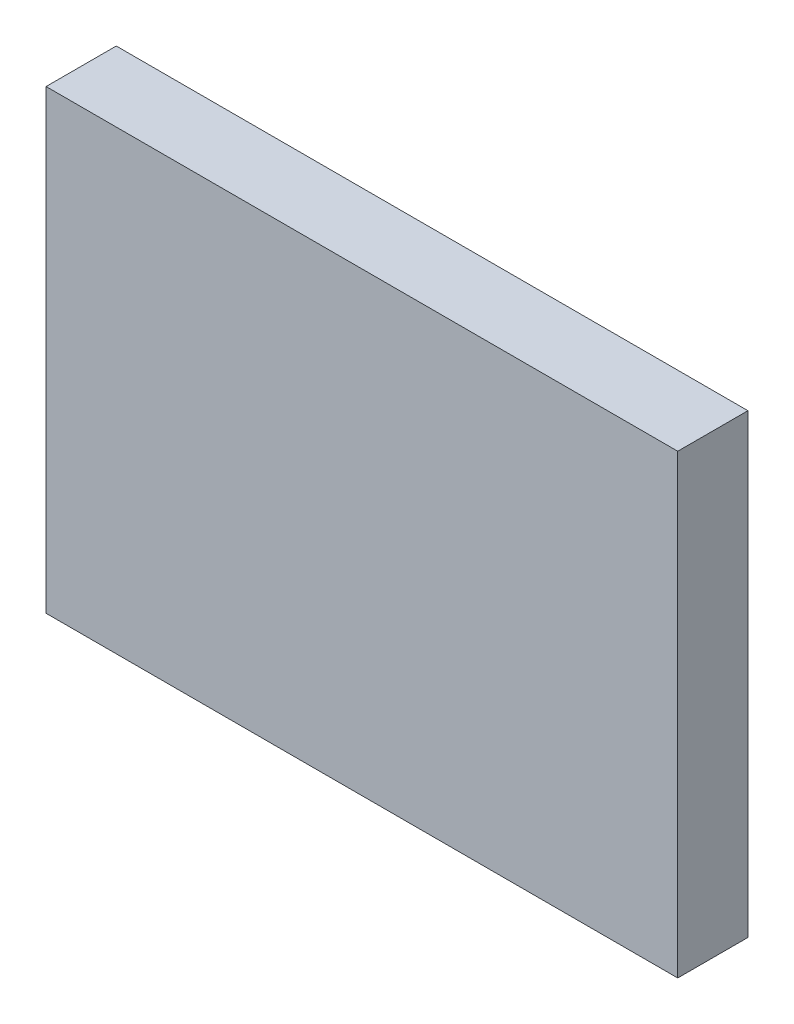
ISO-10303-21;
HEADER;
FILE_DESCRIPTION(('STEP AP214'),'2;1');
FILE_NAME('part.step','',(''),(''),'','','');
FILE_SCHEMA(('AUTOMOTIVE_DESIGN { 1 0 10303 214 1 1 1 1 }'));
ENDSEC;
DATA;
#1=APPLICATION_CONTEXT('core data for automotive mechanical design processes');
#2=APPLICATION_PROTOCOL_DEFINITION('international standard','automotive_design',2000,#1);
#3=PRODUCT_CONTEXT('',#1,'mechanical');
#4=PRODUCT('Part','Part','',(#3));
#5=PRODUCT_RELATED_PRODUCT_CATEGORY('part','',(#4));
#6=PRODUCT_DEFINITION_FORMATION('','',#4);
#7=PRODUCT_DEFINITION_CONTEXT('part definition',#1,'design');
#8=PRODUCT_DEFINITION('design','',#6,#7);
#9=PRODUCT_DEFINITION_SHAPE('','',#8);
#10=(LENGTH_UNIT() NAMED_UNIT(*) SI_UNIT(.MILLI.,.METRE.));
#11=(NAMED_UNIT(*) PLANE_ANGLE_UNIT() SI_UNIT($,.RADIAN.));
#12=(NAMED_UNIT(*) SI_UNIT($,.STERADIAN.) SOLID_ANGLE_UNIT());
#13=UNCERTAINTY_MEASURE_WITH_UNIT(LENGTH_MEASURE(1.E-05),#10,'distance_accuracy_value','');
#14=(GEOMETRIC_REPRESENTATION_CONTEXT(3) GLOBAL_UNCERTAINTY_ASSIGNED_CONTEXT((#13)) GLOBAL_UNIT_ASSIGNED_CONTEXT((#10,
#11,#12)) REPRESENTATION_CONTEXT('',''));
#15=CARTESIAN_POINT('',(0.,0.,0.));
#16=DIRECTION('',(0.,0.,1.));
#17=DIRECTION('',(1.,0.,0.));
#18=AXIS2_PLACEMENT_3D('',#15,#16,#17);
#19=CARTESIAN_POINT('',(-9.,-6.5,2.));
#20=DIRECTION('',(1.,0.,0.));
#21=DIRECTION('',(0.,0.,-1.));
#22=AXIS2_PLACEMENT_3D('',#19,#20,#21);
#23=PLANE('',#22);
#24=DIRECTION('',(0.,-1.,0.));
#25=VECTOR('',#24,1.);
#26=CARTESIAN_POINT('',(-9.,-6.5,0.));
#27=LINE('',#26,#25);
#28=CARTESIAN_POINT('',(-9.,6.5,0.));
#29=VERTEX_POINT('',#28);
#30=CARTESIAN_POINT('',(-9.,-6.5,0.));
#31=VERTEX_POINT('',#30);
#32=EDGE_CURVE('E102',#29,#31,#27,.T.);
#33=ORIENTED_EDGE('',*,*,#32,.T.);
#34=DIRECTION('',(0.,0.,-1.));
#35=VECTOR('',#34,1.);
#36=CARTESIAN_POINT('',(-9.,-6.5,2.));
#37=LINE('',#36,#35);
#38=CARTESIAN_POINT('',(-9.,-6.5,2.));
#39=VERTEX_POINT('',#38);
#40=EDGE_CURVE('E11',#39,#31,#37,.T.);
#41=ORIENTED_EDGE('',*,*,#40,.F.);
#42=DIRECTION('',(0.,-1.,0.));
#43=VECTOR('',#42,1.);
#44=CARTESIAN_POINT('',(-9.,-6.5,2.));
#45=LINE('',#44,#43);
#46=CARTESIAN_POINT('',(-9.,6.5,2.));
#47=VERTEX_POINT('',#46);
#48=EDGE_CURVE('E90',#47,#39,#45,.T.);
#49=ORIENTED_EDGE('',*,*,#48,.F.);
#50=DIRECTION('',(0.,0.,-1.));
#51=VECTOR('',#50,1.);
#52=CARTESIAN_POINT('',(-9.,6.5,2.));
#53=LINE('',#52,#51);
#54=EDGE_CURVE('E98',#47,#29,#53,.T.);
#55=ORIENTED_EDGE('',*,*,#54,.T.);
#56=EDGE_LOOP('',(#33,#41,#49,#55));
#57=FACE_BOUND('',#56,.T.);
#58=ADVANCED_FACE('F39',(#57),#23,.F.);
#59=CARTESIAN_POINT('',(-9.,-6.5,2.));
#60=DIRECTION('',(0.,1.,0.));
#61=DIRECTION('',(0.,0.,1.));
#62=AXIS2_PLACEMENT_3D('',#59,#60,#61);
#63=PLANE('',#62);
#64=DIRECTION('',(1.,0.,0.));
#65=VECTOR('',#64,1.);
#66=CARTESIAN_POINT('',(-9.,-6.5,0.));
#67=LINE('',#66,#65);
#68=CARTESIAN_POINT('',(9.,-6.5,0.));
#69=VERTEX_POINT('',#68);
#70=EDGE_CURVE('E94',#31,#69,#67,.T.);
#71=ORIENTED_EDGE('',*,*,#70,.T.);
#72=DIRECTION('',(0.,0.,-1.));
#73=VECTOR('',#72,1.);
#74=CARTESIAN_POINT('',(9.,-6.5,2.));
#75=LINE('',#74,#73);
#76=CARTESIAN_POINT('',(9.,-6.5,2.));
#77=VERTEX_POINT('',#76);
#78=EDGE_CURVE('E47',#77,#69,#75,.T.);
#79=ORIENTED_EDGE('',*,*,#78,.F.);
#80=DIRECTION('',(1.,0.,0.));
#81=VECTOR('',#80,1.);
#82=CARTESIAN_POINT('',(-9.,-6.5,2.));
#83=LINE('',#82,#81);
#84=EDGE_CURVE('E85',#39,#77,#83,.T.);
#85=ORIENTED_EDGE('',*,*,#84,.F.);
#86=ORIENTED_EDGE('',*,*,#40,.T.);
#87=EDGE_LOOP('',(#71,#79,#85,#86));
#88=FACE_BOUND('',#87,.T.);
#89=ADVANCED_FACE('F93',(#88),#63,.F.);
#90=CARTESIAN_POINT('',(9.,-6.5,2.));
#91=DIRECTION('',(-1.,0.,0.));
#92=DIRECTION('',(0.,0.,1.));
#93=AXIS2_PLACEMENT_3D('',#90,#91,#92);
#94=PLANE('',#93);
#95=DIRECTION('',(0.,1.,0.));
#96=VECTOR('',#95,1.);
#97=CARTESIAN_POINT('',(9.,-6.5,0.));
#98=LINE('',#97,#96);
#99=CARTESIAN_POINT('',(9.,6.5,0.));
#100=VERTEX_POINT('',#99);
#101=EDGE_CURVE('E72',#69,#100,#98,.T.);
#102=ORIENTED_EDGE('',*,*,#101,.T.);
#103=DIRECTION('',(0.,0.,-1.));
#104=VECTOR('',#103,1.);
#105=CARTESIAN_POINT('',(9.,6.5,2.));
#106=LINE('',#105,#104);
#107=CARTESIAN_POINT('',(9.,6.5,2.));
#108=VERTEX_POINT('',#107);
#109=EDGE_CURVE('E95',#108,#100,#106,.T.);
#110=ORIENTED_EDGE('',*,*,#109,.F.);
#111=DIRECTION('',(0.,1.,0.));
#112=VECTOR('',#111,1.);
#113=CARTESIAN_POINT('',(9.,-6.5,2.));
#114=LINE('',#113,#112);
#115=EDGE_CURVE('E88',#77,#108,#114,.T.);
#116=ORIENTED_EDGE('',*,*,#115,.F.);
#117=ORIENTED_EDGE('',*,*,#78,.T.);
#118=EDGE_LOOP('',(#102,#110,#116,#117));
#119=FACE_BOUND('',#118,.T.);
#120=ADVANCED_FACE('F96',(#119),#94,.F.);
#121=CARTESIAN_POINT('',(-9.,6.5,2.));
#122=DIRECTION('',(0.,-1.,0.));
#123=DIRECTION('',(0.,0.,-1.));
#124=AXIS2_PLACEMENT_3D('',#121,#122,#123);
#125=PLANE('',#124);
#126=DIRECTION('',(-1.,0.,0.));
#127=VECTOR('',#126,1.);
#128=CARTESIAN_POINT('',(-9.,6.5,0.));
#129=LINE('',#128,#127);
#130=EDGE_CURVE('E78',#100,#29,#129,.T.);
#131=ORIENTED_EDGE('',*,*,#130,.T.);
#132=ORIENTED_EDGE('',*,*,#54,.F.);
#133=DIRECTION('',(-1.,0.,0.));
#134=VECTOR('',#133,1.);
#135=CARTESIAN_POINT('',(-9.,6.5,2.));
#136=LINE('',#135,#134);
#137=EDGE_CURVE('E55',#108,#47,#136,.T.);
#138=ORIENTED_EDGE('',*,*,#137,.F.);
#139=ORIENTED_EDGE('',*,*,#109,.T.);
#140=EDGE_LOOP('',(#131,#132,#138,#139));
#141=FACE_BOUND('',#140,.T.);
#142=ADVANCED_FACE('F109',(#141),#125,.F.);
#143=CARTESIAN_POINT('',(0.,0.,2.));
#144=DIRECTION('',(0.,0.,-1.));
#145=DIRECTION('',(-1.,0.,0.));
#146=AXIS2_PLACEMENT_3D('',#143,#144,#145);
#147=PLANE('',#146);
#148=ORIENTED_EDGE('',*,*,#48,.T.);
#149=ORIENTED_EDGE('',*,*,#84,.T.);
#150=ORIENTED_EDGE('',*,*,#115,.T.);
#151=ORIENTED_EDGE('',*,*,#137,.T.);
#152=EDGE_LOOP('',(#148,#149,#150,#151));
#153=FACE_BOUND('',#152,.T.);
#154=ADVANCED_FACE('F86',(#153),#147,.F.);
#155=CARTESIAN_POINT('',(0.,0.,0.));
#156=DIRECTION('',(0.,0.,-1.));
#157=DIRECTION('',(-1.,0.,0.));
#158=AXIS2_PLACEMENT_3D('',#155,#156,#157);
#159=PLANE('',#158);
#160=ORIENTED_EDGE('',*,*,#32,.F.);
#161=ORIENTED_EDGE('',*,*,#130,.F.);
#162=ORIENTED_EDGE('',*,*,#101,.F.);
#163=ORIENTED_EDGE('',*,*,#70,.F.);
#164=EDGE_LOOP('',(#160,#161,#162,#163));
#165=FACE_BOUND('',#164,.T.);
#166=ADVANCED_FACE('F112',(#165),#159,.T.);
#167=CLOSED_SHELL('',(#58,#89,#120,#142,#154,#166));
#168=MANIFOLD_SOLID_BREP('B2',#167);
#169=ADVANCED_BREP_SHAPE_REPRESENTATION('',(#18,#168),#14);
#170=SHAPE_DEFINITION_REPRESENTATION(#9,#169);
ENDSEC;
END-ISO-10303-21;
